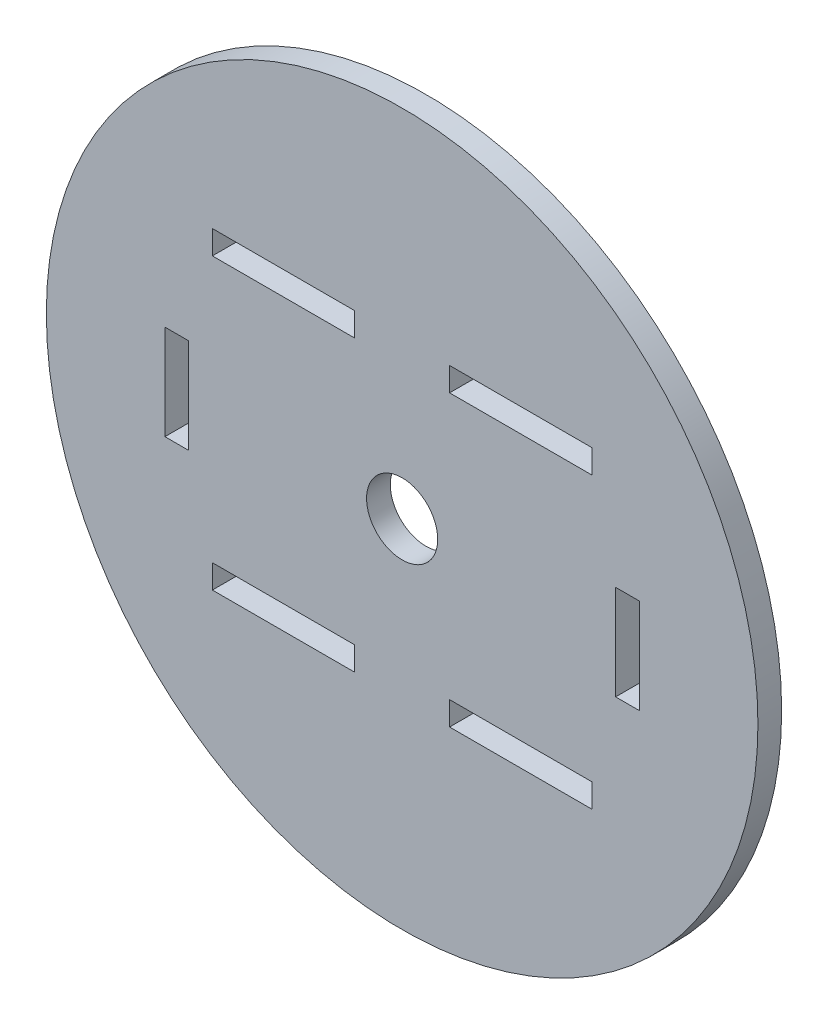
ISO-10303-21;
HEADER;
FILE_DESCRIPTION(('STEP AP214'),'2;1');
FILE_NAME('part.step','',(''),(''),'','','');
FILE_SCHEMA(('AUTOMOTIVE_DESIGN { 1 0 10303 214 1 1 1 1 }'));
ENDSEC;
DATA;
#1=APPLICATION_CONTEXT('core data for automotive mechanical design processes');
#2=APPLICATION_PROTOCOL_DEFINITION('international standard','automotive_design',2000,#1);
#3=PRODUCT_CONTEXT('',#1,'mechanical');
#4=PRODUCT('Part','Part','',(#3));
#5=PRODUCT_RELATED_PRODUCT_CATEGORY('part','',(#4));
#6=PRODUCT_DEFINITION_FORMATION('','',#4);
#7=PRODUCT_DEFINITION_CONTEXT('part definition',#1,'design');
#8=PRODUCT_DEFINITION('design','',#6,#7);
#9=PRODUCT_DEFINITION_SHAPE('','',#8);
#10=(LENGTH_UNIT() NAMED_UNIT(*) SI_UNIT(.MILLI.,.METRE.));
#11=(NAMED_UNIT(*) PLANE_ANGLE_UNIT() SI_UNIT($,.RADIAN.));
#12=(NAMED_UNIT(*) SI_UNIT($,.STERADIAN.) SOLID_ANGLE_UNIT());
#13=UNCERTAINTY_MEASURE_WITH_UNIT(LENGTH_MEASURE(1.E-05),#10,'distance_accuracy_value','');
#14=(GEOMETRIC_REPRESENTATION_CONTEXT(3) GLOBAL_UNCERTAINTY_ASSIGNED_CONTEXT((#13)) GLOBAL_UNIT_ASSIGNED_CONTEXT((#10,
#11,#12)) REPRESENTATION_CONTEXT('',''));
#15=CARTESIAN_POINT('',(0.,0.,0.));
#16=DIRECTION('',(0.,0.,1.));
#17=DIRECTION('',(1.,0.,0.));
#18=AXIS2_PLACEMENT_3D('',#15,#16,#17);
#19=CARTESIAN_POINT('',(0.,0.,3.175));
#20=DIRECTION('',(0.,0.,1.));
#21=DIRECTION('',(1.,0.,0.));
#22=AXIS2_PLACEMENT_3D('',#19,#20,#21);
#23=PLANE('',#22);
#24=CARTESIAN_POINT('',(0.,0.,3.175));
#25=DIRECTION('',(0.,0.,1.));
#26=DIRECTION('',(1.,0.,0.));
#27=AXIS2_PLACEMENT_3D('',#24,#25,#26);
#28=CIRCLE('',#27,47.625);
#29=CARTESIAN_POINT('',(47.625,0.,3.175));
#30=VERTEX_POINT('',#29);
#31=EDGE_CURVE('E11',#30,#30,#28,.T.);
#32=ORIENTED_EDGE('',*,*,#31,.T.);
#33=EDGE_LOOP('',(#32));
#34=FACE_BOUND('',#33,.T.);
#35=CARTESIAN_POINT('',(0.,0.,3.175));
#36=DIRECTION('',(0.,0.,1.));
#37=DIRECTION('',(1.,0.,0.));
#38=AXIS2_PLACEMENT_3D('',#35,#36,#37);
#39=CIRCLE('',#38,4.7625);
#40=CARTESIAN_POINT('',(4.7625,0.,3.175));
#41=VERTEX_POINT('',#40);
#42=EDGE_CURVE('E385',#41,#41,#39,.T.);
#43=ORIENTED_EDGE('',*,*,#42,.F.);
#44=EDGE_LOOP('',(#43));
#45=FACE_BOUND('',#44,.T.);
#46=DIRECTION('',(-1.,0.,0.));
#47=VECTOR('',#46,1.);
#48=CARTESIAN_POINT('',(6.34999999999999,20.955,3.175));
#49=LINE('',#48,#47);
#50=CARTESIAN_POINT('',(25.4,20.955,3.175));
#51=VERTEX_POINT('',#50);
#52=CARTESIAN_POINT('',(6.34999999999999,20.955,3.175));
#53=VERTEX_POINT('',#52);
#54=EDGE_CURVE('E267',#51,#53,#49,.T.);
#55=ORIENTED_EDGE('',*,*,#54,.F.);
#56=DIRECTION('',(0.,1.,0.));
#57=VECTOR('',#56,1.);
#58=CARTESIAN_POINT('',(25.4,17.78,3.175));
#59=LINE('',#58,#57);
#60=CARTESIAN_POINT('',(25.4,17.78,3.175));
#61=VERTEX_POINT('',#60);
#62=EDGE_CURVE('E265',#61,#51,#59,.T.);
#63=ORIENTED_EDGE('',*,*,#62,.F.);
#64=DIRECTION('',(1.,0.,0.));
#65=VECTOR('',#64,1.);
#66=CARTESIAN_POINT('',(6.34999999999999,17.78,3.175));
#67=LINE('',#66,#65);
#68=CARTESIAN_POINT('',(6.34999999999999,17.78,3.175));
#69=VERTEX_POINT('',#68);
#70=EDGE_CURVE('E273',#69,#61,#67,.T.);
#71=ORIENTED_EDGE('',*,*,#70,.F.);
#72=DIRECTION('',(0.,-1.,0.));
#73=VECTOR('',#72,1.);
#74=CARTESIAN_POINT('',(6.34999999999999,17.78,3.175));
#75=LINE('',#74,#73);
#76=EDGE_CURVE('E270',#53,#69,#75,.T.);
#77=ORIENTED_EDGE('',*,*,#76,.F.);
#78=EDGE_LOOP('',(#55,#63,#71,#77));
#79=FACE_BOUND('',#78,.T.);
#80=DIRECTION('',(-1.,0.,0.));
#81=VECTOR('',#80,1.);
#82=CARTESIAN_POINT('',(28.575,6.34999999999999,3.175));
#83=LINE('',#82,#81);
#84=CARTESIAN_POINT('',(31.75,6.34999999999999,3.175));
#85=VERTEX_POINT('',#84);
#86=CARTESIAN_POINT('',(28.575,6.34999999999999,3.175));
#87=VERTEX_POINT('',#86);
#88=EDGE_CURVE('E298',#85,#87,#83,.T.);
#89=ORIENTED_EDGE('',*,*,#88,.F.);
#90=DIRECTION('',(0.,1.,0.));
#91=VECTOR('',#90,1.);
#92=CARTESIAN_POINT('',(31.75,0.,3.175));
#93=LINE('',#92,#91);
#94=CARTESIAN_POINT('',(31.75,-6.35,3.175));
#95=VERTEX_POINT('',#94);
#96=EDGE_CURVE('E296',#95,#85,#93,.T.);
#97=ORIENTED_EDGE('',*,*,#96,.F.);
#98=DIRECTION('',(1.,0.,0.));
#99=VECTOR('',#98,1.);
#100=CARTESIAN_POINT('',(31.75,-6.35,3.175));
#101=LINE('',#100,#99);
#102=CARTESIAN_POINT('',(28.575,-6.35,3.175));
#103=VERTEX_POINT('',#102);
#104=EDGE_CURVE('E304',#103,#95,#101,.T.);
#105=ORIENTED_EDGE('',*,*,#104,.F.);
#106=DIRECTION('',(0.,-1.,0.));
#107=VECTOR('',#106,1.);
#108=CARTESIAN_POINT('',(28.575,-6.35,3.175));
#109=LINE('',#108,#107);
#110=EDGE_CURVE('E301',#87,#103,#109,.T.);
#111=ORIENTED_EDGE('',*,*,#110,.F.);
#112=EDGE_LOOP('',(#89,#97,#105,#111));
#113=FACE_BOUND('',#112,.T.);
#114=DIRECTION('',(-1.,0.,0.));
#115=VECTOR('',#114,1.);
#116=CARTESIAN_POINT('',(-25.4,20.955,3.175));
#117=LINE('',#116,#115);
#118=CARTESIAN_POINT('',(-6.35,20.955,3.175));
#119=VERTEX_POINT('',#118);
#120=CARTESIAN_POINT('',(-25.4,20.955,3.175));
#121=VERTEX_POINT('',#120);
#122=EDGE_CURVE('E327',#119,#121,#117,.T.);
#123=ORIENTED_EDGE('',*,*,#122,.F.);
#124=DIRECTION('',(0.,1.,0.));
#125=VECTOR('',#124,1.);
#126=CARTESIAN_POINT('',(-6.35,17.78,3.175));
#127=LINE('',#126,#125);
#128=CARTESIAN_POINT('',(-6.35,17.78,3.175));
#129=VERTEX_POINT('',#128);
#130=EDGE_CURVE('E325',#129,#119,#127,.T.);
#131=ORIENTED_EDGE('',*,*,#130,.F.);
#132=DIRECTION('',(1.,0.,0.));
#133=VECTOR('',#132,1.);
#134=CARTESIAN_POINT('',(-25.4,17.78,3.175));
#135=LINE('',#134,#133);
#136=CARTESIAN_POINT('',(-25.4,17.78,3.175));
#137=VERTEX_POINT('',#136);
#138=EDGE_CURVE('E333',#137,#129,#135,.T.);
#139=ORIENTED_EDGE('',*,*,#138,.F.);
#140=DIRECTION('',(0.,-1.,0.));
#141=VECTOR('',#140,1.);
#142=CARTESIAN_POINT('',(-25.4,17.78,3.175));
#143=LINE('',#142,#141);
#144=EDGE_CURVE('E330',#121,#137,#143,.T.);
#145=ORIENTED_EDGE('',*,*,#144,.F.);
#146=EDGE_LOOP('',(#123,#131,#139,#145));
#147=FACE_BOUND('',#146,.T.);
#148=DIRECTION('',(-1.,0.,0.));
#149=VECTOR('',#148,1.);
#150=CARTESIAN_POINT('',(-25.4,-17.78,3.175));
#151=LINE('',#150,#149);
#152=CARTESIAN_POINT('',(-6.35,-17.78,3.175));
#153=VERTEX_POINT('',#152);
#154=CARTESIAN_POINT('',(-25.4,-17.78,3.175));
#155=VERTEX_POINT('',#154);
#156=EDGE_CURVE('E358',#153,#155,#151,.T.);
#157=ORIENTED_EDGE('',*,*,#156,.F.);
#158=DIRECTION('',(0.,1.,0.));
#159=VECTOR('',#158,1.);
#160=CARTESIAN_POINT('',(-6.35,-20.955,3.175));
#161=LINE('',#160,#159);
#162=CARTESIAN_POINT('',(-6.35,-20.955,3.175));
#163=VERTEX_POINT('',#162);
#164=EDGE_CURVE('E356',#163,#153,#161,.T.);
#165=ORIENTED_EDGE('',*,*,#164,.F.);
#166=DIRECTION('',(1.,0.,0.));
#167=VECTOR('',#166,1.);
#168=CARTESIAN_POINT('',(-25.4,-20.955,3.175));
#169=LINE('',#168,#167);
#170=CARTESIAN_POINT('',(-25.4,-20.955,3.175));
#171=VERTEX_POINT('',#170);
#172=EDGE_CURVE('E364',#171,#163,#169,.T.);
#173=ORIENTED_EDGE('',*,*,#172,.F.);
#174=DIRECTION('',(0.,-1.,0.));
#175=VECTOR('',#174,1.);
#176=CARTESIAN_POINT('',(-25.4,-20.955,3.175));
#177=LINE('',#176,#175);
#178=EDGE_CURVE('E361',#155,#171,#177,.T.);
#179=ORIENTED_EDGE('',*,*,#178,.F.);
#180=EDGE_LOOP('',(#157,#165,#173,#179));
#181=FACE_BOUND('',#180,.T.);
#182=DIRECTION('',(-1.,0.,0.));
#183=VECTOR('',#182,1.);
#184=CARTESIAN_POINT('',(6.35,-17.78,3.175));
#185=LINE('',#184,#183);
#186=CARTESIAN_POINT('',(25.4,-17.78,3.175));
#187=VERTEX_POINT('',#186);
#188=CARTESIAN_POINT('',(6.35,-17.78,3.175));
#189=VERTEX_POINT('',#188);
#190=EDGE_CURVE('E237',#187,#189,#185,.T.);
#191=ORIENTED_EDGE('',*,*,#190,.F.);
#192=DIRECTION('',(0.,1.,0.));
#193=VECTOR('',#192,1.);
#194=CARTESIAN_POINT('',(25.4,-20.955,3.175));
#195=LINE('',#194,#193);
#196=CARTESIAN_POINT('',(25.4,-20.955,3.175));
#197=VERTEX_POINT('',#196);
#198=EDGE_CURVE('E235',#197,#187,#195,.T.);
#199=ORIENTED_EDGE('',*,*,#198,.F.);
#200=DIRECTION('',(1.,0.,0.));
#201=VECTOR('',#200,1.);
#202=CARTESIAN_POINT('',(6.35,-20.955,3.175));
#203=LINE('',#202,#201);
#204=CARTESIAN_POINT('',(6.35,-20.955,3.175));
#205=VERTEX_POINT('',#204);
#206=EDGE_CURVE('E242',#205,#197,#203,.T.);
#207=ORIENTED_EDGE('',*,*,#206,.F.);
#208=DIRECTION('',(0.,-1.,0.));
#209=VECTOR('',#208,1.);
#210=CARTESIAN_POINT('',(6.35,-20.955,3.175));
#211=LINE('',#210,#209);
#212=EDGE_CURVE('E240',#189,#205,#211,.T.);
#213=ORIENTED_EDGE('',*,*,#212,.F.);
#214=EDGE_LOOP('',(#191,#199,#207,#213));
#215=FACE_BOUND('',#214,.T.);
#216=DIRECTION('',(0.,-1.,0.));
#217=VECTOR('',#216,1.);
#218=CARTESIAN_POINT('',(-31.75,-6.35,3.175));
#219=LINE('',#218,#217);
#220=CARTESIAN_POINT('',(-31.75,6.35,3.175));
#221=VERTEX_POINT('',#220);
#222=CARTESIAN_POINT('',(-31.75,-6.35,3.175));
#223=VERTEX_POINT('',#222);
#224=EDGE_CURVE('E216',#221,#223,#219,.T.);
#225=ORIENTED_EDGE('',*,*,#224,.F.);
#226=DIRECTION('',(-1.,0.,0.));
#227=VECTOR('',#226,1.);
#228=CARTESIAN_POINT('',(-31.75,6.35,3.175));
#229=LINE('',#228,#227);
#230=CARTESIAN_POINT('',(-28.575,6.35,3.175));
#231=VERTEX_POINT('',#230);
#232=EDGE_CURVE('E203',#231,#221,#229,.T.);
#233=ORIENTED_EDGE('',*,*,#232,.F.);
#234=DIRECTION('',(0.,1.,0.));
#235=VECTOR('',#234,1.);
#236=CARTESIAN_POINT('',(-28.575,0.,3.175));
#237=LINE('',#236,#235);
#238=CARTESIAN_POINT('',(-28.575,-6.35,3.175));
#239=VERTEX_POINT('',#238);
#240=EDGE_CURVE('E195',#239,#231,#237,.T.);
#241=ORIENTED_EDGE('',*,*,#240,.F.);
#242=DIRECTION('',(1.,0.,0.));
#243=VECTOR('',#242,1.);
#244=CARTESIAN_POINT('',(-28.575,-6.35,3.175));
#245=LINE('',#244,#243);
#246=EDGE_CURVE('E218',#223,#239,#245,.T.);
#247=ORIENTED_EDGE('',*,*,#246,.F.);
#248=EDGE_LOOP('',(#225,#233,#241,#247));
#249=FACE_BOUND('',#248,.T.);
#250=ADVANCED_FACE('F36',(#34,#45,#79,#113,#147,#181,#215,#249),#23,.T.);
#251=CARTESIAN_POINT('',(0.,0.,0.));
#252=DIRECTION('',(0.,0.,1.));
#253=DIRECTION('',(1.,0.,0.));
#254=AXIS2_PLACEMENT_3D('',#251,#252,#253);
#255=PLANE('',#254);
#256=DIRECTION('',(0.,1.,0.));
#257=VECTOR('',#256,1.);
#258=CARTESIAN_POINT('',(25.4,-20.955,0.));
#259=LINE('',#258,#257);
#260=CARTESIAN_POINT('',(25.4,-20.955,0.));
#261=VERTEX_POINT('',#260);
#262=CARTESIAN_POINT('',(25.4,-17.78,0.));
#263=VERTEX_POINT('',#262);
#264=EDGE_CURVE('E245',#261,#263,#259,.T.);
#265=ORIENTED_EDGE('',*,*,#264,.T.);
#266=DIRECTION('',(-1.,0.,0.));
#267=VECTOR('',#266,1.);
#268=CARTESIAN_POINT('',(6.35,-17.78,0.));
#269=LINE('',#268,#267);
#270=CARTESIAN_POINT('',(6.35,-17.78,0.));
#271=VERTEX_POINT('',#270);
#272=EDGE_CURVE('E248',#263,#271,#269,.T.);
#273=ORIENTED_EDGE('',*,*,#272,.T.);
#274=DIRECTION('',(0.,-1.,0.));
#275=VECTOR('',#274,1.);
#276=CARTESIAN_POINT('',(6.35,-20.955,0.));
#277=LINE('',#276,#275);
#278=CARTESIAN_POINT('',(6.35,-20.955,0.));
#279=VERTEX_POINT('',#278);
#280=EDGE_CURVE('E251',#271,#279,#277,.T.);
#281=ORIENTED_EDGE('',*,*,#280,.T.);
#282=DIRECTION('',(1.,0.,0.));
#283=VECTOR('',#282,1.);
#284=CARTESIAN_POINT('',(6.35,-20.955,0.));
#285=LINE('',#284,#283);
#286=EDGE_CURVE('E238',#279,#261,#285,.T.);
#287=ORIENTED_EDGE('',*,*,#286,.T.);
#288=EDGE_LOOP('',(#265,#273,#281,#287));
#289=FACE_BOUND('',#288,.T.);
#290=DIRECTION('',(0.,1.,0.));
#291=VECTOR('',#290,1.);
#292=CARTESIAN_POINT('',(-6.35,17.78,0.));
#293=LINE('',#292,#291);
#294=CARTESIAN_POINT('',(-6.35,17.78,0.));
#295=VERTEX_POINT('',#294);
#296=CARTESIAN_POINT('',(-6.35,20.955,0.));
#297=VERTEX_POINT('',#296);
#298=EDGE_CURVE('E336',#295,#297,#293,.T.);
#299=ORIENTED_EDGE('',*,*,#298,.T.);
#300=DIRECTION('',(-1.,0.,0.));
#301=VECTOR('',#300,1.);
#302=CARTESIAN_POINT('',(-25.4,20.955,0.));
#303=LINE('',#302,#301);
#304=CARTESIAN_POINT('',(-25.4,20.955,0.));
#305=VERTEX_POINT('',#304);
#306=EDGE_CURVE('E339',#297,#305,#303,.T.);
#307=ORIENTED_EDGE('',*,*,#306,.T.);
#308=DIRECTION('',(0.,-1.,0.));
#309=VECTOR('',#308,1.);
#310=CARTESIAN_POINT('',(-25.4,17.78,0.));
#311=LINE('',#310,#309);
#312=CARTESIAN_POINT('',(-25.4,17.78,0.));
#313=VERTEX_POINT('',#312);
#314=EDGE_CURVE('E343',#305,#313,#311,.T.);
#315=ORIENTED_EDGE('',*,*,#314,.T.);
#316=DIRECTION('',(1.,0.,0.));
#317=VECTOR('',#316,1.);
#318=CARTESIAN_POINT('',(-25.4,17.78,0.));
#319=LINE('',#318,#317);
#320=EDGE_CURVE('E328',#313,#295,#319,.T.);
#321=ORIENTED_EDGE('',*,*,#320,.T.);
#322=EDGE_LOOP('',(#299,#307,#315,#321));
#323=FACE_BOUND('',#322,.T.);
#324=DIRECTION('',(0.,1.,0.));
#325=VECTOR('',#324,1.);
#326=CARTESIAN_POINT('',(25.4,17.78,0.));
#327=LINE('',#326,#325);
#328=CARTESIAN_POINT('',(25.4,17.78,0.));
#329=VERTEX_POINT('',#328);
#330=CARTESIAN_POINT('',(25.4,20.955,0.));
#331=VERTEX_POINT('',#330);
#332=EDGE_CURVE('E276',#329,#331,#327,.T.);
#333=ORIENTED_EDGE('',*,*,#332,.T.);
#334=DIRECTION('',(-1.,0.,0.));
#335=VECTOR('',#334,1.);
#336=CARTESIAN_POINT('',(6.34999999999999,20.955,0.));
#337=LINE('',#336,#335);
#338=CARTESIAN_POINT('',(6.34999999999999,20.955,0.));
#339=VERTEX_POINT('',#338);
#340=EDGE_CURVE('E279',#331,#339,#337,.T.);
#341=ORIENTED_EDGE('',*,*,#340,.T.);
#342=DIRECTION('',(0.,-1.,0.));
#343=VECTOR('',#342,1.);
#344=CARTESIAN_POINT('',(6.34999999999999,17.78,0.));
#345=LINE('',#344,#343);
#346=CARTESIAN_POINT('',(6.34999999999999,17.78,0.));
#347=VERTEX_POINT('',#346);
#348=EDGE_CURVE('E283',#339,#347,#345,.T.);
#349=ORIENTED_EDGE('',*,*,#348,.T.);
#350=DIRECTION('',(1.,0.,0.));
#351=VECTOR('',#350,1.);
#352=CARTESIAN_POINT('',(6.34999999999999,17.78,0.));
#353=LINE('',#352,#351);
#354=EDGE_CURVE('E268',#347,#329,#353,.T.);
#355=ORIENTED_EDGE('',*,*,#354,.T.);
#356=EDGE_LOOP('',(#333,#341,#349,#355));
#357=FACE_BOUND('',#356,.T.);
#358=CARTESIAN_POINT('',(0.,0.,0.));
#359=DIRECTION('',(0.,0.,1.));
#360=DIRECTION('',(1.,0.,0.));
#361=AXIS2_PLACEMENT_3D('',#358,#359,#360);
#362=CIRCLE('',#361,47.625);
#363=CARTESIAN_POINT('',(47.625,0.,0.));
#364=VERTEX_POINT('',#363);
#365=EDGE_CURVE('E40',#364,#364,#362,.T.);
#366=ORIENTED_EDGE('',*,*,#365,.F.);
#367=EDGE_LOOP('',(#366));
#368=FACE_BOUND('',#367,.T.);
#369=CARTESIAN_POINT('',(0.,0.,0.));
#370=DIRECTION('',(0.,0.,1.));
#371=DIRECTION('',(1.,0.,0.));
#372=AXIS2_PLACEMENT_3D('',#369,#370,#371);
#373=CIRCLE('',#372,4.7625);
#374=CARTESIAN_POINT('',(4.7625,0.,0.));
#375=VERTEX_POINT('',#374);
#376=EDGE_CURVE('E212',#375,#375,#373,.T.);
#377=ORIENTED_EDGE('',*,*,#376,.T.);
#378=EDGE_LOOP('',(#377));
#379=FACE_BOUND('',#378,.T.);
#380=DIRECTION('',(0.,1.,0.));
#381=VECTOR('',#380,1.);
#382=CARTESIAN_POINT('',(31.75,0.,0.));
#383=LINE('',#382,#381);
#384=CARTESIAN_POINT('',(31.75,-6.35,0.));
#385=VERTEX_POINT('',#384);
#386=CARTESIAN_POINT('',(31.75,6.34999999999999,0.));
#387=VERTEX_POINT('',#386);
#388=EDGE_CURVE('E307',#385,#387,#383,.T.);
#389=ORIENTED_EDGE('',*,*,#388,.T.);
#390=DIRECTION('',(-1.,0.,0.));
#391=VECTOR('',#390,1.);
#392=CARTESIAN_POINT('',(28.575,6.34999999999999,0.));
#393=LINE('',#392,#391);
#394=CARTESIAN_POINT('',(28.575,6.34999999999999,0.));
#395=VERTEX_POINT('',#394);
#396=EDGE_CURVE('E310',#387,#395,#393,.T.);
#397=ORIENTED_EDGE('',*,*,#396,.T.);
#398=DIRECTION('',(0.,-1.,0.));
#399=VECTOR('',#398,1.);
#400=CARTESIAN_POINT('',(28.575,-6.35,0.));
#401=LINE('',#400,#399);
#402=CARTESIAN_POINT('',(28.575,-6.35,0.));
#403=VERTEX_POINT('',#402);
#404=EDGE_CURVE('E314',#395,#403,#401,.T.);
#405=ORIENTED_EDGE('',*,*,#404,.T.);
#406=DIRECTION('',(1.,0.,0.));
#407=VECTOR('',#406,1.);
#408=CARTESIAN_POINT('',(31.75,-6.35,0.));
#409=LINE('',#408,#407);
#410=EDGE_CURVE('E299',#403,#385,#409,.T.);
#411=ORIENTED_EDGE('',*,*,#410,.T.);
#412=EDGE_LOOP('',(#389,#397,#405,#411));
#413=FACE_BOUND('',#412,.T.);
#414=DIRECTION('',(0.,1.,0.));
#415=VECTOR('',#414,1.);
#416=CARTESIAN_POINT('',(-6.35,-20.955,0.));
#417=LINE('',#416,#415);
#418=CARTESIAN_POINT('',(-6.35,-20.955,0.));
#419=VERTEX_POINT('',#418);
#420=CARTESIAN_POINT('',(-6.35,-17.78,0.));
#421=VERTEX_POINT('',#420);
#422=EDGE_CURVE('E264',#419,#421,#417,.T.);
#423=ORIENTED_EDGE('',*,*,#422,.T.);
#424=DIRECTION('',(-1.,0.,0.));
#425=VECTOR('',#424,1.);
#426=CARTESIAN_POINT('',(-25.4,-17.78,0.));
#427=LINE('',#426,#425);
#428=CARTESIAN_POINT('',(-25.4,-17.78,0.));
#429=VERTEX_POINT('',#428);
#430=EDGE_CURVE('E369',#421,#429,#427,.T.);
#431=ORIENTED_EDGE('',*,*,#430,.T.);
#432=DIRECTION('',(0.,-1.,0.));
#433=VECTOR('',#432,1.);
#434=CARTESIAN_POINT('',(-25.4,-20.955,0.));
#435=LINE('',#434,#433);
#436=CARTESIAN_POINT('',(-25.4,-20.955,0.));
#437=VERTEX_POINT('',#436);
#438=EDGE_CURVE('E372',#429,#437,#435,.T.);
#439=ORIENTED_EDGE('',*,*,#438,.T.);
#440=DIRECTION('',(1.,0.,0.));
#441=VECTOR('',#440,1.);
#442=CARTESIAN_POINT('',(-25.4,-20.955,0.));
#443=LINE('',#442,#441);
#444=EDGE_CURVE('E359',#437,#419,#443,.T.);
#445=ORIENTED_EDGE('',*,*,#444,.T.);
#446=EDGE_LOOP('',(#423,#431,#439,#445));
#447=FACE_BOUND('',#446,.T.);
#448=DIRECTION('',(-1.,0.,0.));
#449=VECTOR('',#448,1.);
#450=CARTESIAN_POINT('',(-31.75,6.35,0.));
#451=LINE('',#450,#449);
#452=CARTESIAN_POINT('',(-28.575,6.35,0.));
#453=VERTEX_POINT('',#452);
#454=CARTESIAN_POINT('',(-31.75,6.35,0.));
#455=VERTEX_POINT('',#454);
#456=EDGE_CURVE('E210',#453,#455,#451,.T.);
#457=ORIENTED_EDGE('',*,*,#456,.T.);
#458=DIRECTION('',(0.,-1.,0.));
#459=VECTOR('',#458,1.);
#460=CARTESIAN_POINT('',(-31.75,-6.35,0.));
#461=LINE('',#460,#459);
#462=CARTESIAN_POINT('',(-31.75,-6.35,0.));
#463=VERTEX_POINT('',#462);
#464=EDGE_CURVE('E223',#455,#463,#461,.T.);
#465=ORIENTED_EDGE('',*,*,#464,.T.);
#466=DIRECTION('',(1.,0.,0.));
#467=VECTOR('',#466,1.);
#468=CARTESIAN_POINT('',(-28.575,-6.35,0.));
#469=LINE('',#468,#467);
#470=CARTESIAN_POINT('',(-28.575,-6.35,0.));
#471=VERTEX_POINT('',#470);
#472=EDGE_CURVE('E227',#463,#471,#469,.T.);
#473=ORIENTED_EDGE('',*,*,#472,.T.);
#474=DIRECTION('',(0.,1.,0.));
#475=VECTOR('',#474,1.);
#476=CARTESIAN_POINT('',(-28.575,0.,0.));
#477=LINE('',#476,#475);
#478=EDGE_CURVE('E204',#471,#453,#477,.T.);
#479=ORIENTED_EDGE('',*,*,#478,.T.);
#480=EDGE_LOOP('',(#457,#465,#473,#479));
#481=FACE_BOUND('',#480,.T.);
#482=ADVANCED_FACE('F391',(#289,#323,#357,#368,#379,#413,#447,#481),#255,.F.);
#483=CARTESIAN_POINT('',(0.,0.,3.175));
#484=DIRECTION('',(0.,0.,-1.));
#485=DIRECTION('',(-1.,0.,0.));
#486=AXIS2_PLACEMENT_3D('',#483,#484,#485);
#487=CYLINDRICAL_SURFACE('',#486,47.625);
#488=ORIENTED_EDGE('',*,*,#31,.F.);
#489=EDGE_LOOP('',(#488));
#490=FACE_BOUND('',#489,.T.);
#491=ORIENTED_EDGE('',*,*,#365,.T.);
#492=EDGE_LOOP('',(#491));
#493=FACE_BOUND('',#492,.T.);
#494=ADVANCED_FACE('F38',(#490,#493),#487,.T.);
#495=CARTESIAN_POINT('',(0.,0.,3.175));
#496=DIRECTION('',(0.,0.,-1.));
#497=DIRECTION('',(-1.,0.,0.));
#498=AXIS2_PLACEMENT_3D('',#495,#496,#497);
#499=CYLINDRICAL_SURFACE('',#498,4.7625);
#500=ORIENTED_EDGE('',*,*,#42,.T.);
#501=EDGE_LOOP('',(#500));
#502=FACE_BOUND('',#501,.T.);
#503=ORIENTED_EDGE('',*,*,#376,.F.);
#504=EDGE_LOOP('',(#503));
#505=FACE_BOUND('',#504,.T.);
#506=ADVANCED_FACE('F394',(#502,#505),#499,.F.);
#507=CARTESIAN_POINT('',(25.4,17.78,3.175));
#508=DIRECTION('',(-1.,0.,0.));
#509=DIRECTION('',(0.,0.,1.));
#510=AXIS2_PLACEMENT_3D('',#507,#508,#509);
#511=PLANE('',#510);
#512=ORIENTED_EDGE('',*,*,#332,.F.);
#513=DIRECTION('',(0.,0.,-1.));
#514=VECTOR('',#513,1.);
#515=CARTESIAN_POINT('',(25.4,17.78,3.175));
#516=LINE('',#515,#514);
#517=EDGE_CURVE('E275',#61,#329,#516,.T.);
#518=ORIENTED_EDGE('',*,*,#517,.F.);
#519=ORIENTED_EDGE('',*,*,#62,.T.);
#520=DIRECTION('',(0.,0.,-1.));
#521=VECTOR('',#520,1.);
#522=CARTESIAN_POINT('',(25.4,20.955,3.175));
#523=LINE('',#522,#521);
#524=EDGE_CURVE('E224',#51,#331,#523,.T.);
#525=ORIENTED_EDGE('',*,*,#524,.T.);
#526=EDGE_LOOP('',(#512,#518,#519,#525));
#527=FACE_BOUND('',#526,.T.);
#528=ADVANCED_FACE('F396',(#527),#511,.T.);
#529=CARTESIAN_POINT('',(6.34999999999999,20.955,3.175));
#530=DIRECTION('',(0.,-1.,0.));
#531=DIRECTION('',(0.,0.,-1.));
#532=AXIS2_PLACEMENT_3D('',#529,#530,#531);
#533=PLANE('',#532);
#534=ORIENTED_EDGE('',*,*,#340,.F.);
#535=ORIENTED_EDGE('',*,*,#524,.F.);
#536=ORIENTED_EDGE('',*,*,#54,.T.);
#537=DIRECTION('',(0.,0.,-1.));
#538=VECTOR('',#537,1.);
#539=CARTESIAN_POINT('',(6.34999999999999,20.955,3.175));
#540=LINE('',#539,#538);
#541=EDGE_CURVE('E292',#53,#339,#540,.T.);
#542=ORIENTED_EDGE('',*,*,#541,.T.);
#543=EDGE_LOOP('',(#534,#535,#536,#542));
#544=FACE_BOUND('',#543,.T.);
#545=ADVANCED_FACE('F403',(#544),#533,.T.);
#546=CARTESIAN_POINT('',(6.34999999999999,17.78,3.175));
#547=DIRECTION('',(1.,0.,0.));
#548=DIRECTION('',(0.,0.,-1.));
#549=AXIS2_PLACEMENT_3D('',#546,#547,#548);
#550=PLANE('',#549);
#551=ORIENTED_EDGE('',*,*,#348,.F.);
#552=ORIENTED_EDGE('',*,*,#541,.F.);
#553=ORIENTED_EDGE('',*,*,#76,.T.);
#554=DIRECTION('',(0.,0.,-1.));
#555=VECTOR('',#554,1.);
#556=CARTESIAN_POINT('',(6.34999999999999,17.78,3.175));
#557=LINE('',#556,#555);
#558=EDGE_CURVE('E290',#69,#347,#557,.T.);
#559=ORIENTED_EDGE('',*,*,#558,.T.);
#560=EDGE_LOOP('',(#551,#552,#553,#559));
#561=FACE_BOUND('',#560,.T.);
#562=ADVANCED_FACE('F471',(#561),#550,.T.);
#563=CARTESIAN_POINT('',(6.34999999999999,17.78,3.175));
#564=DIRECTION('',(0.,1.,0.));
#565=DIRECTION('',(0.,0.,1.));
#566=AXIS2_PLACEMENT_3D('',#563,#564,#565);
#567=PLANE('',#566);
#568=ORIENTED_EDGE('',*,*,#354,.F.);
#569=ORIENTED_EDGE('',*,*,#558,.F.);
#570=ORIENTED_EDGE('',*,*,#70,.T.);
#571=ORIENTED_EDGE('',*,*,#517,.T.);
#572=EDGE_LOOP('',(#568,#569,#570,#571));
#573=FACE_BOUND('',#572,.T.);
#574=ADVANCED_FACE('F467',(#573),#567,.T.);
#575=CARTESIAN_POINT('',(31.75,0.,3.175));
#576=DIRECTION('',(-1.,0.,0.));
#577=DIRECTION('',(0.,-1.,0.));
#578=AXIS2_PLACEMENT_3D('',#575,#576,#577);
#579=PLANE('',#578);
#580=ORIENTED_EDGE('',*,*,#388,.F.);
#581=DIRECTION('',(0.,0.,-1.));
#582=VECTOR('',#581,1.);
#583=CARTESIAN_POINT('',(31.75,-6.35,3.175));
#584=LINE('',#583,#582);
#585=EDGE_CURVE('E306',#95,#385,#584,.T.);
#586=ORIENTED_EDGE('',*,*,#585,.F.);
#587=ORIENTED_EDGE('',*,*,#96,.T.);
#588=DIRECTION('',(0.,0.,-1.));
#589=VECTOR('',#588,1.);
#590=CARTESIAN_POINT('',(31.75,6.34999999999999,3.175));
#591=LINE('',#590,#589);
#592=EDGE_CURVE('E280',#85,#387,#591,.T.);
#593=ORIENTED_EDGE('',*,*,#592,.T.);
#594=EDGE_LOOP('',(#580,#586,#587,#593));
#595=FACE_BOUND('',#594,.T.);
#596=ADVANCED_FACE('F470',(#595),#579,.T.);
#597=CARTESIAN_POINT('',(28.575,6.34999999999999,3.175));
#598=DIRECTION('',(0.,-1.,0.));
#599=DIRECTION('',(0.,0.,-1.));
#600=AXIS2_PLACEMENT_3D('',#597,#598,#599);
#601=PLANE('',#600);
#602=ORIENTED_EDGE('',*,*,#396,.F.);
#603=ORIENTED_EDGE('',*,*,#592,.F.);
#604=ORIENTED_EDGE('',*,*,#88,.T.);
#605=DIRECTION('',(0.,0.,-1.));
#606=VECTOR('',#605,1.);
#607=CARTESIAN_POINT('',(28.575,6.34999999999999,3.175));
#608=LINE('',#607,#606);
#609=EDGE_CURVE('E322',#87,#395,#608,.T.);
#610=ORIENTED_EDGE('',*,*,#609,.T.);
#611=EDGE_LOOP('',(#602,#603,#604,#610));
#612=FACE_BOUND('',#611,.T.);
#613=ADVANCED_FACE('F487',(#612),#601,.T.);
#614=CARTESIAN_POINT('',(28.575,-6.35,3.175));
#615=DIRECTION('',(1.,0.,0.));
#616=DIRECTION('',(0.,0.,-1.));
#617=AXIS2_PLACEMENT_3D('',#614,#615,#616);
#618=PLANE('',#617);
#619=ORIENTED_EDGE('',*,*,#404,.F.);
#620=ORIENTED_EDGE('',*,*,#609,.F.);
#621=ORIENTED_EDGE('',*,*,#110,.T.);
#622=DIRECTION('',(0.,0.,-1.));
#623=VECTOR('',#622,1.);
#624=CARTESIAN_POINT('',(28.575,-6.35,3.175));
#625=LINE('',#624,#623);
#626=EDGE_CURVE('E320',#103,#403,#625,.T.);
#627=ORIENTED_EDGE('',*,*,#626,.T.);
#628=EDGE_LOOP('',(#619,#620,#621,#627));
#629=FACE_BOUND('',#628,.T.);
#630=ADVANCED_FACE('F483',(#629),#618,.T.);
#631=CARTESIAN_POINT('',(31.75,-6.35,3.175));
#632=DIRECTION('',(0.,1.,0.));
#633=DIRECTION('',(0.,0.,1.));
#634=AXIS2_PLACEMENT_3D('',#631,#632,#633);
#635=PLANE('',#634);
#636=ORIENTED_EDGE('',*,*,#410,.F.);
#637=ORIENTED_EDGE('',*,*,#626,.F.);
#638=ORIENTED_EDGE('',*,*,#104,.T.);
#639=ORIENTED_EDGE('',*,*,#585,.T.);
#640=EDGE_LOOP('',(#636,#637,#638,#639));
#641=FACE_BOUND('',#640,.T.);
#642=ADVANCED_FACE('F479',(#641),#635,.T.);
#643=CARTESIAN_POINT('',(-6.35,17.78,3.175));
#644=DIRECTION('',(-1.,0.,0.));
#645=DIRECTION('',(0.,0.,1.));
#646=AXIS2_PLACEMENT_3D('',#643,#644,#645);
#647=PLANE('',#646);
#648=ORIENTED_EDGE('',*,*,#298,.F.);
#649=DIRECTION('',(0.,0.,-1.));
#650=VECTOR('',#649,1.);
#651=CARTESIAN_POINT('',(-6.35,17.78,3.175));
#652=LINE('',#651,#650);
#653=EDGE_CURVE('E335',#129,#295,#652,.T.);
#654=ORIENTED_EDGE('',*,*,#653,.F.);
#655=ORIENTED_EDGE('',*,*,#130,.T.);
#656=DIRECTION('',(0.,0.,-1.));
#657=VECTOR('',#656,1.);
#658=CARTESIAN_POINT('',(-6.35,20.955,3.175));
#659=LINE('',#658,#657);
#660=EDGE_CURVE('E311',#119,#297,#659,.T.);
#661=ORIENTED_EDGE('',*,*,#660,.T.);
#662=EDGE_LOOP('',(#648,#654,#655,#661));
#663=FACE_BOUND('',#662,.T.);
#664=ADVANCED_FACE('F482',(#663),#647,.T.);
#665=CARTESIAN_POINT('',(-25.4,20.955,3.175));
#666=DIRECTION('',(0.,-1.,0.));
#667=DIRECTION('',(0.,0.,-1.));
#668=AXIS2_PLACEMENT_3D('',#665,#666,#667);
#669=PLANE('',#668);
#670=ORIENTED_EDGE('',*,*,#306,.F.);
#671=ORIENTED_EDGE('',*,*,#660,.F.);
#672=ORIENTED_EDGE('',*,*,#122,.T.);
#673=DIRECTION('',(0.,0.,-1.));
#674=VECTOR('',#673,1.);
#675=CARTESIAN_POINT('',(-25.4,20.955,3.175));
#676=LINE('',#675,#674);
#677=EDGE_CURVE('E352',#121,#305,#676,.T.);
#678=ORIENTED_EDGE('',*,*,#677,.T.);
#679=EDGE_LOOP('',(#670,#671,#672,#678));
#680=FACE_BOUND('',#679,.T.);
#681=ADVANCED_FACE('F503',(#680),#669,.T.);
#682=CARTESIAN_POINT('',(-25.4,17.78,3.175));
#683=DIRECTION('',(1.,0.,0.));
#684=DIRECTION('',(0.,1.,0.));
#685=AXIS2_PLACEMENT_3D('',#682,#683,#684);
#686=PLANE('',#685);
#687=ORIENTED_EDGE('',*,*,#314,.F.);
#688=ORIENTED_EDGE('',*,*,#677,.F.);
#689=ORIENTED_EDGE('',*,*,#144,.T.);
#690=DIRECTION('',(0.,0.,-1.));
#691=VECTOR('',#690,1.);
#692=CARTESIAN_POINT('',(-25.4,17.78,3.175));
#693=LINE('',#692,#691);
#694=EDGE_CURVE('E350',#137,#313,#693,.T.);
#695=ORIENTED_EDGE('',*,*,#694,.T.);
#696=EDGE_LOOP('',(#687,#688,#689,#695));
#697=FACE_BOUND('',#696,.T.);
#698=ADVANCED_FACE('F499',(#697),#686,.T.);
#699=CARTESIAN_POINT('',(-25.4,17.78,3.175));
#700=DIRECTION('',(0.,1.,0.));
#701=DIRECTION('',(0.,0.,1.));
#702=AXIS2_PLACEMENT_3D('',#699,#700,#701);
#703=PLANE('',#702);
#704=ORIENTED_EDGE('',*,*,#320,.F.);
#705=ORIENTED_EDGE('',*,*,#694,.F.);
#706=ORIENTED_EDGE('',*,*,#138,.T.);
#707=ORIENTED_EDGE('',*,*,#653,.T.);
#708=EDGE_LOOP('',(#704,#705,#706,#707));
#709=FACE_BOUND('',#708,.T.);
#710=ADVANCED_FACE('F495',(#709),#703,.T.);
#711=CARTESIAN_POINT('',(-6.35,-20.955,3.175));
#712=DIRECTION('',(-1.,0.,0.));
#713=DIRECTION('',(0.,0.,1.));
#714=AXIS2_PLACEMENT_3D('',#711,#712,#713);
#715=PLANE('',#714);
#716=ORIENTED_EDGE('',*,*,#422,.F.);
#717=DIRECTION('',(0.,0.,-1.));
#718=VECTOR('',#717,1.);
#719=CARTESIAN_POINT('',(-6.35,-20.955,3.175));
#720=LINE('',#719,#718);
#721=EDGE_CURVE('E366',#163,#419,#720,.T.);
#722=ORIENTED_EDGE('',*,*,#721,.F.);
#723=ORIENTED_EDGE('',*,*,#164,.T.);
#724=DIRECTION('',(0.,0.,-1.));
#725=VECTOR('',#724,1.);
#726=CARTESIAN_POINT('',(-6.35,-17.78,3.175));
#727=LINE('',#726,#725);
#728=EDGE_CURVE('E340',#153,#421,#727,.T.);
#729=ORIENTED_EDGE('',*,*,#728,.T.);
#730=EDGE_LOOP('',(#716,#722,#723,#729));
#731=FACE_BOUND('',#730,.T.);
#732=ADVANCED_FACE('F498',(#731),#715,.T.);
#733=CARTESIAN_POINT('',(-25.4,-17.78,3.175));
#734=DIRECTION('',(0.,-1.,0.));
#735=DIRECTION('',(0.,0.,-1.));
#736=AXIS2_PLACEMENT_3D('',#733,#734,#735);
#737=PLANE('',#736);
#738=ORIENTED_EDGE('',*,*,#430,.F.);
#739=ORIENTED_EDGE('',*,*,#728,.F.);
#740=ORIENTED_EDGE('',*,*,#156,.T.);
#741=DIRECTION('',(0.,0.,-1.));
#742=VECTOR('',#741,1.);
#743=CARTESIAN_POINT('',(-25.4,-17.78,3.175));
#744=LINE('',#743,#742);
#745=EDGE_CURVE('E381',#155,#429,#744,.T.);
#746=ORIENTED_EDGE('',*,*,#745,.T.);
#747=EDGE_LOOP('',(#738,#739,#740,#746));
#748=FACE_BOUND('',#747,.T.);
#749=ADVANCED_FACE('F517',(#748),#737,.T.);
#750=CARTESIAN_POINT('',(-25.4,-20.955,3.175));
#751=DIRECTION('',(1.,0.,0.));
#752=DIRECTION('',(0.,0.,-1.));
#753=AXIS2_PLACEMENT_3D('',#750,#751,#752);
#754=PLANE('',#753);
#755=ORIENTED_EDGE('',*,*,#438,.F.);
#756=ORIENTED_EDGE('',*,*,#745,.F.);
#757=ORIENTED_EDGE('',*,*,#178,.T.);
#758=DIRECTION('',(0.,0.,-1.));
#759=VECTOR('',#758,1.);
#760=CARTESIAN_POINT('',(-25.4,-20.955,3.175));
#761=LINE('',#760,#759);
#762=EDGE_CURVE('E379',#171,#437,#761,.T.);
#763=ORIENTED_EDGE('',*,*,#762,.T.);
#764=EDGE_LOOP('',(#755,#756,#757,#763));
#765=FACE_BOUND('',#764,.T.);
#766=ADVANCED_FACE('F513',(#765),#754,.T.);
#767=CARTESIAN_POINT('',(-25.4,-20.955,3.175));
#768=DIRECTION('',(0.,1.,0.));
#769=DIRECTION('',(0.,0.,1.));
#770=AXIS2_PLACEMENT_3D('',#767,#768,#769);
#771=PLANE('',#770);
#772=ORIENTED_EDGE('',*,*,#444,.F.);
#773=ORIENTED_EDGE('',*,*,#762,.F.);
#774=ORIENTED_EDGE('',*,*,#172,.T.);
#775=ORIENTED_EDGE('',*,*,#721,.T.);
#776=EDGE_LOOP('',(#772,#773,#774,#775));
#777=FACE_BOUND('',#776,.T.);
#778=ADVANCED_FACE('F466',(#777),#771,.T.);
#779=CARTESIAN_POINT('',(25.4,-20.955,3.175));
#780=DIRECTION('',(-1.,0.,0.));
#781=DIRECTION('',(0.,0.,1.));
#782=AXIS2_PLACEMENT_3D('',#779,#780,#781);
#783=PLANE('',#782);
#784=ORIENTED_EDGE('',*,*,#264,.F.);
#785=DIRECTION('',(0.,0.,-1.));
#786=VECTOR('',#785,1.);
#787=CARTESIAN_POINT('',(25.4,-20.955,3.175));
#788=LINE('',#787,#786);
#789=EDGE_CURVE('E244',#197,#261,#788,.T.);
#790=ORIENTED_EDGE('',*,*,#789,.F.);
#791=ORIENTED_EDGE('',*,*,#198,.T.);
#792=DIRECTION('',(0.,0.,-1.));
#793=VECTOR('',#792,1.);
#794=CARTESIAN_POINT('',(25.4,-17.78,3.175));
#795=LINE('',#794,#793);
#796=EDGE_CURVE('E261',#187,#263,#795,.T.);
#797=ORIENTED_EDGE('',*,*,#796,.T.);
#798=EDGE_LOOP('',(#784,#790,#791,#797));
#799=FACE_BOUND('',#798,.T.);
#800=ADVANCED_FACE('F448',(#799),#783,.T.);
#801=CARTESIAN_POINT('',(6.35,-17.78,3.175));
#802=DIRECTION('',(0.,-1.,0.));
#803=DIRECTION('',(0.,0.,-1.));
#804=AXIS2_PLACEMENT_3D('',#801,#802,#803);
#805=PLANE('',#804);
#806=ORIENTED_EDGE('',*,*,#272,.F.);
#807=ORIENTED_EDGE('',*,*,#796,.F.);
#808=ORIENTED_EDGE('',*,*,#190,.T.);
#809=DIRECTION('',(0.,0.,-1.));
#810=VECTOR('',#809,1.);
#811=CARTESIAN_POINT('',(6.35,-17.78,3.175));
#812=LINE('',#811,#810);
#813=EDGE_CURVE('E259',#189,#271,#812,.T.);
#814=ORIENTED_EDGE('',*,*,#813,.T.);
#815=EDGE_LOOP('',(#806,#807,#808,#814));
#816=FACE_BOUND('',#815,.T.);
#817=ADVANCED_FACE('F442',(#816),#805,.T.);
#818=CARTESIAN_POINT('',(6.35,-20.955,3.175));
#819=DIRECTION('',(1.,0.,0.));
#820=DIRECTION('',(0.,0.,-1.));
#821=AXIS2_PLACEMENT_3D('',#818,#819,#820);
#822=PLANE('',#821);
#823=ORIENTED_EDGE('',*,*,#280,.F.);
#824=ORIENTED_EDGE('',*,*,#813,.F.);
#825=ORIENTED_EDGE('',*,*,#212,.T.);
#826=DIRECTION('',(0.,0.,-1.));
#827=VECTOR('',#826,1.);
#828=CARTESIAN_POINT('',(6.35,-20.955,3.175));
#829=LINE('',#828,#827);
#830=EDGE_CURVE('E59',#205,#279,#829,.T.);
#831=ORIENTED_EDGE('',*,*,#830,.T.);
#832=EDGE_LOOP('',(#823,#824,#825,#831));
#833=FACE_BOUND('',#832,.T.);
#834=ADVANCED_FACE('F445',(#833),#822,.T.);
#835=CARTESIAN_POINT('',(6.35,-20.955,3.175));
#836=DIRECTION('',(0.,1.,0.));
#837=DIRECTION('',(0.,0.,1.));
#838=AXIS2_PLACEMENT_3D('',#835,#836,#837);
#839=PLANE('',#838);
#840=ORIENTED_EDGE('',*,*,#286,.F.);
#841=ORIENTED_EDGE('',*,*,#830,.F.);
#842=ORIENTED_EDGE('',*,*,#206,.T.);
#843=ORIENTED_EDGE('',*,*,#789,.T.);
#844=EDGE_LOOP('',(#840,#841,#842,#843));
#845=FACE_BOUND('',#844,.T.);
#846=ADVANCED_FACE('F450',(#845),#839,.T.);
#847=CARTESIAN_POINT('',(-31.75,6.35,3.175));
#848=DIRECTION('',(0.,-1.,0.));
#849=DIRECTION('',(0.,0.,-1.));
#850=AXIS2_PLACEMENT_3D('',#847,#848,#849);
#851=PLANE('',#850);
#852=ORIENTED_EDGE('',*,*,#456,.F.);
#853=DIRECTION('',(0.,0.,-1.));
#854=VECTOR('',#853,1.);
#855=CARTESIAN_POINT('',(-28.575,6.35,3.175));
#856=LINE('',#855,#854);
#857=EDGE_CURVE('E198',#231,#453,#856,.T.);
#858=ORIENTED_EDGE('',*,*,#857,.F.);
#859=ORIENTED_EDGE('',*,*,#232,.T.);
#860=DIRECTION('',(0.,0.,-1.));
#861=VECTOR('',#860,1.);
#862=CARTESIAN_POINT('',(-31.75,6.35,3.175));
#863=LINE('',#862,#861);
#864=EDGE_CURVE('E213',#221,#455,#863,.T.);
#865=ORIENTED_EDGE('',*,*,#864,.T.);
#866=EDGE_LOOP('',(#852,#858,#859,#865));
#867=FACE_BOUND('',#866,.T.);
#868=ADVANCED_FACE('F207',(#867),#851,.T.);
#869=CARTESIAN_POINT('',(-31.75,-6.35,3.175));
#870=DIRECTION('',(1.,0.,0.));
#871=DIRECTION('',(0.,0.,-1.));
#872=AXIS2_PLACEMENT_3D('',#869,#870,#871);
#873=PLANE('',#872);
#874=ORIENTED_EDGE('',*,*,#464,.F.);
#875=ORIENTED_EDGE('',*,*,#864,.F.);
#876=ORIENTED_EDGE('',*,*,#224,.T.);
#877=DIRECTION('',(0.,0.,-1.));
#878=VECTOR('',#877,1.);
#879=CARTESIAN_POINT('',(-31.75,-6.35,3.175));
#880=LINE('',#879,#878);
#881=EDGE_CURVE('E232',#223,#463,#880,.T.);
#882=ORIENTED_EDGE('',*,*,#881,.T.);
#883=EDGE_LOOP('',(#874,#875,#876,#882));
#884=FACE_BOUND('',#883,.T.);
#885=ADVANCED_FACE('F457',(#884),#873,.T.);
#886=CARTESIAN_POINT('',(-28.575,-6.35,3.175));
#887=DIRECTION('',(0.,1.,0.));
#888=DIRECTION('',(0.,0.,1.));
#889=AXIS2_PLACEMENT_3D('',#886,#887,#888);
#890=PLANE('',#889);
#891=ORIENTED_EDGE('',*,*,#472,.F.);
#892=ORIENTED_EDGE('',*,*,#881,.F.);
#893=ORIENTED_EDGE('',*,*,#246,.T.);
#894=DIRECTION('',(0.,0.,-1.));
#895=VECTOR('',#894,1.);
#896=CARTESIAN_POINT('',(-28.575,-6.35,3.175));
#897=LINE('',#896,#895);
#898=EDGE_CURVE('E51',#239,#471,#897,.T.);
#899=ORIENTED_EDGE('',*,*,#898,.T.);
#900=EDGE_LOOP('',(#891,#892,#893,#899));
#901=FACE_BOUND('',#900,.T.);
#902=ADVANCED_FACE('F537',(#901),#890,.T.);
#903=CARTESIAN_POINT('',(-28.575,0.,3.175));
#904=DIRECTION('',(-1.,0.,0.));
#905=DIRECTION('',(0.,0.,1.));
#906=AXIS2_PLACEMENT_3D('',#903,#904,#905);
#907=PLANE('',#906);
#908=ORIENTED_EDGE('',*,*,#478,.F.);
#909=ORIENTED_EDGE('',*,*,#898,.F.);
#910=ORIENTED_EDGE('',*,*,#240,.T.);
#911=ORIENTED_EDGE('',*,*,#857,.T.);
#912=EDGE_LOOP('',(#908,#909,#910,#911));
#913=FACE_BOUND('',#912,.T.);
#914=ADVANCED_FACE('F197',(#913),#907,.T.);
#915=CLOSED_SHELL('',(#250,#482,#494,#506,#528,#545,#562,#574,#596,#613,#630,#642,#664,#681,
#698,#710,#732,#749,#766,#778,#800,#817,#834,#846,#868,#885,#902,#914));
#916=MANIFOLD_SOLID_BREP('B2',#915);
#917=ADVANCED_BREP_SHAPE_REPRESENTATION('',(#18,#916),#14);
#918=SHAPE_DEFINITION_REPRESENTATION(#9,#917);
ENDSEC;
END-ISO-10303-21;
